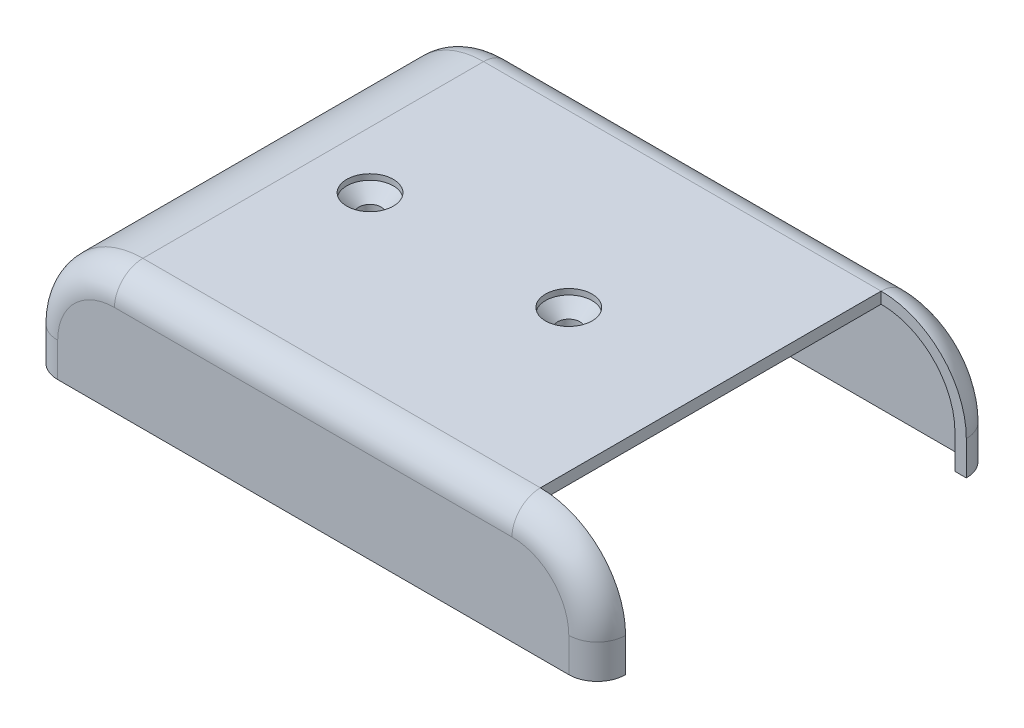
ISO-10303-21;
HEADER;
FILE_DESCRIPTION(('STEP AP214'),'2;1');
FILE_NAME('part.step','',(''),(''),'','','');
FILE_SCHEMA(('AUTOMOTIVE_DESIGN { 1 0 10303 214 1 1 1 1 }'));
ENDSEC;
DATA;
#1=APPLICATION_CONTEXT('core data for automotive mechanical design processes');
#2=APPLICATION_PROTOCOL_DEFINITION('international standard','automotive_design',2000,#1);
#3=PRODUCT_CONTEXT('',#1,'mechanical');
#4=PRODUCT('Part','Part','',(#3));
#5=PRODUCT_RELATED_PRODUCT_CATEGORY('part','',(#4));
#6=PRODUCT_DEFINITION_FORMATION('','',#4);
#7=PRODUCT_DEFINITION_CONTEXT('part definition',#1,'design');
#8=PRODUCT_DEFINITION('design','',#6,#7);
#9=PRODUCT_DEFINITION_SHAPE('','',#8);
#10=(LENGTH_UNIT() NAMED_UNIT(*) SI_UNIT(.MILLI.,.METRE.));
#11=(NAMED_UNIT(*) PLANE_ANGLE_UNIT() SI_UNIT($,.RADIAN.));
#12=(NAMED_UNIT(*) SI_UNIT($,.STERADIAN.) SOLID_ANGLE_UNIT());
#13=UNCERTAINTY_MEASURE_WITH_UNIT(LENGTH_MEASURE(1.E-05),#10,'distance_accuracy_value','');
#14=(GEOMETRIC_REPRESENTATION_CONTEXT(3) GLOBAL_UNCERTAINTY_ASSIGNED_CONTEXT((#13)) GLOBAL_UNIT_ASSIGNED_CONTEXT((#10,
#11,#12)) REPRESENTATION_CONTEXT('',''));
#15=CARTESIAN_POINT('',(0.,0.,0.));
#16=DIRECTION('',(0.,0.,1.));
#17=DIRECTION('',(1.,0.,0.));
#18=AXIS2_PLACEMENT_3D('',#15,#16,#17);
#19=CARTESIAN_POINT('',(0.,0.,0.));
#20=DIRECTION('',(0.,1.,0.));
#21=DIRECTION('',(0.,0.,1.));
#22=AXIS2_PLACEMENT_3D('',#19,#20,#21);
#23=PLANE('',#22);
#24=CARTESIAN_POINT('',(45.,0.,-30.));
#25=DIRECTION('',(0.,1.,0.));
#26=DIRECTION('',(0.,0.,1.));
#27=AXIS2_PLACEMENT_3D('',#24,#25,#26);
#28=CIRCLE('',#27,5.);
#29=CARTESIAN_POINT('',(45.,0.,-35.));
#30=VERTEX_POINT('',#29);
#31=CARTESIAN_POINT('',(50.,0.,-30.));
#32=VERTEX_POINT('',#31);
#33=EDGE_CURVE('E408',#30,#32,#28,.F.);
#34=ORIENTED_EDGE('',*,*,#33,.T.);
#35=DIRECTION('',(-1.,0.,0.));
#36=VECTOR('',#35,1.);
#37=CARTESIAN_POINT('',(0.,0.,-30.));
#38=LINE('',#37,#36);
#39=CARTESIAN_POINT('',(48.,0.,-30.));
#40=VERTEX_POINT('',#39);
#41=EDGE_CURVE('E495',#32,#40,#38,.T.);
#42=ORIENTED_EDGE('',*,*,#41,.T.);
#43=CARTESIAN_POINT('',(45.,0.,-30.));
#44=DIRECTION('',(0.,1.,0.));
#45=DIRECTION('',(0.,0.,1.));
#46=AXIS2_PLACEMENT_3D('',#43,#44,#45);
#47=CIRCLE('',#46,3.);
#48=CARTESIAN_POINT('',(45.,0.,-33.));
#49=VERTEX_POINT('',#48);
#50=EDGE_CURVE('E359',#49,#40,#47,.F.);
#51=ORIENTED_EDGE('',*,*,#50,.F.);
#52=DIRECTION('',(-1.,0.,0.));
#53=VECTOR('',#52,1.);
#54=CARTESIAN_POINT('',(-50.,0.,-33.));
#55=LINE('',#54,#53);
#56=CARTESIAN_POINT('',(-45.,0.,-33.));
#57=VERTEX_POINT('',#56);
#58=EDGE_CURVE('E356',#49,#57,#55,.T.);
#59=ORIENTED_EDGE('',*,*,#58,.T.);
#60=CARTESIAN_POINT('',(-45.,0.,-30.));
#61=DIRECTION('',(0.,1.,0.));
#62=DIRECTION('',(0.,0.,1.));
#63=AXIS2_PLACEMENT_3D('',#60,#61,#62);
#64=CIRCLE('',#63,3.);
#65=CARTESIAN_POINT('',(-48.,0.,-30.));
#66=VERTEX_POINT('',#65);
#67=EDGE_CURVE('E353',#66,#57,#64,.F.);
#68=ORIENTED_EDGE('',*,*,#67,.F.);
#69=DIRECTION('',(0.,0.,1.));
#70=VECTOR('',#69,1.);
#71=CARTESIAN_POINT('',(-48.,0.,-35.));
#72=LINE('',#71,#70);
#73=CARTESIAN_POINT('',(-48.,0.,30.));
#74=VERTEX_POINT('',#73);
#75=EDGE_CURVE('E61',#66,#74,#72,.T.);
#76=ORIENTED_EDGE('',*,*,#75,.T.);
#77=CARTESIAN_POINT('',(-45.,0.,30.));
#78=DIRECTION('',(0.,1.,0.));
#79=DIRECTION('',(0.,0.,1.));
#80=AXIS2_PLACEMENT_3D('',#77,#78,#79);
#81=CIRCLE('',#80,3.);
#82=CARTESIAN_POINT('',(-45.,0.,33.));
#83=VERTEX_POINT('',#82);
#84=EDGE_CURVE('E345',#83,#74,#81,.F.);
#85=ORIENTED_EDGE('',*,*,#84,.F.);
#86=DIRECTION('',(1.,0.,0.));
#87=VECTOR('',#86,1.);
#88=CARTESIAN_POINT('',(-50.,0.,33.));
#89=LINE('',#88,#87);
#90=CARTESIAN_POINT('',(45.,0.,33.));
#91=VERTEX_POINT('',#90);
#92=EDGE_CURVE('E347',#83,#91,#89,.T.);
#93=ORIENTED_EDGE('',*,*,#92,.T.);
#94=CARTESIAN_POINT('',(45.,0.,30.));
#95=DIRECTION('',(0.,1.,0.));
#96=DIRECTION('',(0.,0.,1.));
#97=AXIS2_PLACEMENT_3D('',#94,#95,#96);
#98=CIRCLE('',#97,3.);
#99=CARTESIAN_POINT('',(48.,0.,30.));
#100=VERTEX_POINT('',#99);
#101=EDGE_CURVE('E342',#100,#91,#98,.F.);
#102=ORIENTED_EDGE('',*,*,#101,.F.);
#103=DIRECTION('',(1.,0.,0.));
#104=VECTOR('',#103,1.);
#105=CARTESIAN_POINT('',(0.,0.,30.));
#106=LINE('',#105,#104);
#107=CARTESIAN_POINT('',(50.,0.,30.));
#108=VERTEX_POINT('',#107);
#109=EDGE_CURVE('E455',#100,#108,#106,.T.);
#110=ORIENTED_EDGE('',*,*,#109,.T.);
#111=CARTESIAN_POINT('',(45.,0.,30.));
#112=DIRECTION('',(0.,1.,0.));
#113=DIRECTION('',(0.,0.,1.));
#114=AXIS2_PLACEMENT_3D('',#111,#112,#113);
#115=CIRCLE('',#114,5.);
#116=CARTESIAN_POINT('',(45.,0.,35.));
#117=VERTEX_POINT('',#116);
#118=EDGE_CURVE('E399',#108,#117,#115,.F.);
#119=ORIENTED_EDGE('',*,*,#118,.T.);
#120=DIRECTION('',(1.,0.,0.));
#121=VECTOR('',#120,1.);
#122=CARTESIAN_POINT('',(-50.,0.,35.));
#123=LINE('',#122,#121);
#124=CARTESIAN_POINT('',(-45.,0.,35.));
#125=VERTEX_POINT('',#124);
#126=EDGE_CURVE('E375',#125,#117,#123,.T.);
#127=ORIENTED_EDGE('',*,*,#126,.F.);
#128=CARTESIAN_POINT('',(-45.,0.,30.));
#129=DIRECTION('',(0.,1.,0.));
#130=DIRECTION('',(0.,0.,1.));
#131=AXIS2_PLACEMENT_3D('',#128,#129,#130);
#132=CIRCLE('',#131,5.);
#133=CARTESIAN_POINT('',(-50.,0.,30.));
#134=VERTEX_POINT('',#133);
#135=EDGE_CURVE('E402',#125,#134,#132,.F.);
#136=ORIENTED_EDGE('',*,*,#135,.T.);
#137=DIRECTION('',(0.,0.,1.));
#138=VECTOR('',#137,1.);
#139=CARTESIAN_POINT('',(-50.,0.,-35.));
#140=LINE('',#139,#138);
#141=CARTESIAN_POINT('',(-50.,0.,-30.));
#142=VERTEX_POINT('',#141);
#143=EDGE_CURVE('E371',#142,#134,#140,.T.);
#144=ORIENTED_EDGE('',*,*,#143,.F.);
#145=CARTESIAN_POINT('',(-45.,0.,-30.));
#146=DIRECTION('',(0.,1.,0.));
#147=DIRECTION('',(0.,0.,1.));
#148=AXIS2_PLACEMENT_3D('',#145,#146,#147);
#149=CIRCLE('',#148,5.);
#150=CARTESIAN_POINT('',(-45.,0.,-35.));
#151=VERTEX_POINT('',#150);
#152=EDGE_CURVE('E405',#142,#151,#149,.F.);
#153=ORIENTED_EDGE('',*,*,#152,.T.);
#154=DIRECTION('',(-1.,0.,0.));
#155=VECTOR('',#154,1.);
#156=CARTESIAN_POINT('',(-50.,0.,-35.));
#157=LINE('',#156,#155);
#158=EDGE_CURVE('E277',#30,#151,#157,.T.);
#159=ORIENTED_EDGE('',*,*,#158,.F.);
#160=EDGE_LOOP('',(#34,#42,#51,#59,#68,#76,#85,#93,#102,#110,#119,#127,#136,#144,#153,#159));
#161=FACE_BOUND('',#160,.T.);
#162=ADVANCED_FACE('F45',(#161),#23,.F.);
#163=CARTESIAN_POINT('',(-50.,21.,-35.));
#164=DIRECTION('',(0.,0.,1.));
#165=DIRECTION('',(1.,0.,0.));
#166=AXIS2_PLACEMENT_3D('',#163,#164,#165);
#167=PLANE('',#166);
#168=CARTESIAN_POINT('',(35.,6.,-35.));
#169=DIRECTION('',(0.,0.,1.));
#170=DIRECTION('',(1.,0.,0.));
#171=AXIS2_PLACEMENT_3D('',#168,#169,#170);
#172=CIRCLE('',#171,10.);
#173=CARTESIAN_POINT('',(35.,16.,-35.));
#174=VERTEX_POINT('',#173);
#175=CARTESIAN_POINT('',(45.,6.,-35.));
#176=VERTEX_POINT('',#175);
#177=EDGE_CURVE('E263',#174,#176,#172,.F.);
#178=ORIENTED_EDGE('',*,*,#177,.T.);
#179=DIRECTION('',(0.,-1.,0.));
#180=VECTOR('',#179,1.);
#181=CARTESIAN_POINT('',(45.,21.,-35.));
#182=LINE('',#181,#180);
#183=EDGE_CURVE('E395',#176,#30,#182,.T.);
#184=ORIENTED_EDGE('',*,*,#183,.T.);
#185=ORIENTED_EDGE('',*,*,#158,.T.);
#186=DIRECTION('',(0.,-1.,0.));
#187=VECTOR('',#186,1.);
#188=CARTESIAN_POINT('',(-45.,21.,-35.));
#189=LINE('',#188,#187);
#190=CARTESIAN_POINT('',(-45.,6.,-35.));
#191=VERTEX_POINT('',#190);
#192=EDGE_CURVE('E390',#151,#191,#189,.F.);
#193=ORIENTED_EDGE('',*,*,#192,.T.);
#194=CARTESIAN_POINT('',(-35.,6.,-35.));
#195=DIRECTION('',(0.,0.,1.));
#196=DIRECTION('',(1.,0.,0.));
#197=AXIS2_PLACEMENT_3D('',#194,#195,#196);
#198=CIRCLE('',#197,10.);
#199=CARTESIAN_POINT('',(-35.,16.,-35.));
#200=VERTEX_POINT('',#199);
#201=EDGE_CURVE('E387',#191,#200,#198,.F.);
#202=ORIENTED_EDGE('',*,*,#201,.T.);
#203=DIRECTION('',(-1.,0.,0.));
#204=VECTOR('',#203,1.);
#205=CARTESIAN_POINT('',(35.,16.,-35.));
#206=LINE('',#205,#204);
#207=EDGE_CURVE('E384',#200,#174,#206,.F.);
#208=ORIENTED_EDGE('',*,*,#207,.T.);
#209=EDGE_LOOP('',(#178,#184,#185,#193,#202,#208));
#210=FACE_BOUND('',#209,.T.);
#211=ADVANCED_FACE('F489',(#210),#167,.F.);
#212=CARTESIAN_POINT('',(-50.,21.,-35.));
#213=DIRECTION('',(1.,0.,0.));
#214=DIRECTION('',(0.,0.,-1.));
#215=AXIS2_PLACEMENT_3D('',#212,#213,#214);
#216=PLANE('',#215);
#217=DIRECTION('',(0.,0.,1.));
#218=VECTOR('',#217,1.);
#219=CARTESIAN_POINT('',(-50.,6.,-35.));
#220=LINE('',#219,#218);
#221=CARTESIAN_POINT('',(-50.,6.,30.));
#222=VERTEX_POINT('',#221);
#223=CARTESIAN_POINT('',(-50.,6.,-30.));
#224=VERTEX_POINT('',#223);
#225=EDGE_CURVE('E248',#222,#224,#220,.F.);
#226=ORIENTED_EDGE('',*,*,#225,.T.);
#227=DIRECTION('',(0.,-1.,0.));
#228=VECTOR('',#227,1.);
#229=CARTESIAN_POINT('',(-50.,21.,-30.));
#230=LINE('',#229,#228);
#231=EDGE_CURVE('E421',#224,#142,#230,.T.);
#232=ORIENTED_EDGE('',*,*,#231,.T.);
#233=ORIENTED_EDGE('',*,*,#143,.T.);
#234=DIRECTION('',(0.,-1.,0.));
#235=VECTOR('',#234,1.);
#236=CARTESIAN_POINT('',(-50.,21.,30.));
#237=LINE('',#236,#235);
#238=EDGE_CURVE('E222',#134,#222,#237,.F.);
#239=ORIENTED_EDGE('',*,*,#238,.T.);
#240=EDGE_LOOP('',(#226,#232,#233,#239));
#241=FACE_BOUND('',#240,.T.);
#242=ADVANCED_FACE('F474',(#241),#216,.F.);
#243=CARTESIAN_POINT('',(-50.,21.,35.));
#244=DIRECTION('',(0.,0.,-1.));
#245=DIRECTION('',(-1.,0.,0.));
#246=AXIS2_PLACEMENT_3D('',#243,#244,#245);
#247=PLANE('',#246);
#248=CARTESIAN_POINT('',(-35.,6.,35.));
#249=DIRECTION('',(0.,0.,-1.));
#250=DIRECTION('',(-1.,0.,0.));
#251=AXIS2_PLACEMENT_3D('',#248,#249,#250);
#252=CIRCLE('',#251,10.);
#253=CARTESIAN_POINT('',(-35.,16.,35.));
#254=VERTEX_POINT('',#253);
#255=CARTESIAN_POINT('',(-45.,6.,35.));
#256=VERTEX_POINT('',#255);
#257=EDGE_CURVE('E69',#254,#256,#252,.F.);
#258=ORIENTED_EDGE('',*,*,#257,.T.);
#259=DIRECTION('',(0.,-1.,0.));
#260=VECTOR('',#259,1.);
#261=CARTESIAN_POINT('',(-45.,21.,35.));
#262=LINE('',#261,#260);
#263=EDGE_CURVE('E441',#256,#125,#262,.T.);
#264=ORIENTED_EDGE('',*,*,#263,.T.);
#265=ORIENTED_EDGE('',*,*,#126,.T.);
#266=DIRECTION('',(0.,-1.,0.));
#267=VECTOR('',#266,1.);
#268=CARTESIAN_POINT('',(45.,21.,35.));
#269=LINE('',#268,#267);
#270=CARTESIAN_POINT('',(45.,6.,35.));
#271=VERTEX_POINT('',#270);
#272=EDGE_CURVE('E436',#117,#271,#269,.F.);
#273=ORIENTED_EDGE('',*,*,#272,.T.);
#274=CARTESIAN_POINT('',(35.,6.,35.));
#275=DIRECTION('',(0.,0.,-1.));
#276=DIRECTION('',(-1.,0.,0.));
#277=AXIS2_PLACEMENT_3D('',#274,#275,#276);
#278=CIRCLE('',#277,10.);
#279=CARTESIAN_POINT('',(35.,16.,35.));
#280=VERTEX_POINT('',#279);
#281=EDGE_CURVE('E433',#271,#280,#278,.F.);
#282=ORIENTED_EDGE('',*,*,#281,.T.);
#283=DIRECTION('',(1.,0.,0.));
#284=VECTOR('',#283,1.);
#285=CARTESIAN_POINT('',(-35.,16.,35.));
#286=LINE('',#285,#284);
#287=EDGE_CURVE('E430',#280,#254,#286,.F.);
#288=ORIENTED_EDGE('',*,*,#287,.T.);
#289=EDGE_LOOP('',(#258,#264,#265,#273,#282,#288));
#290=FACE_BOUND('',#289,.T.);
#291=ADVANCED_FACE('F447',(#290),#247,.F.);
#292=CARTESIAN_POINT('',(0.,21.,0.));
#293=DIRECTION('',(0.,1.,0.));
#294=DIRECTION('',(0.,0.,1.));
#295=AXIS2_PLACEMENT_3D('',#292,#293,#294);
#296=PLANE('',#295);
#297=CARTESIAN_POINT('',(-25.,21.,0.));
#298=DIRECTION('',(0.,1.,0.));
#299=DIRECTION('',(0.,0.,1.));
#300=AXIS2_PLACEMENT_3D('',#297,#298,#299);
#301=CIRCLE('',#300,4.1);
#302=CARTESIAN_POINT('',(-25.,21.,4.1));
#303=VERTEX_POINT('',#302);
#304=EDGE_CURVE('E1071',#303,#303,#301,.T.);
#305=ORIENTED_EDGE('',*,*,#304,.F.);
#306=EDGE_LOOP('',(#305));
#307=FACE_BOUND('',#306,.T.);
#308=CARTESIAN_POINT('',(10.,21.,0.));
#309=DIRECTION('',(0.,1.,0.));
#310=DIRECTION('',(0.,0.,1.));
#311=AXIS2_PLACEMENT_3D('',#308,#309,#310);
#312=CIRCLE('',#311,4.1);
#313=CARTESIAN_POINT('',(10.,21.,4.1));
#314=VERTEX_POINT('',#313);
#315=EDGE_CURVE('E1085',#314,#314,#312,.T.);
#316=ORIENTED_EDGE('',*,*,#315,.F.);
#317=EDGE_LOOP('',(#316));
#318=FACE_BOUND('',#317,.T.);
#319=DIRECTION('',(0.,0.,-1.));
#320=VECTOR('',#319,1.);
#321=CARTESIAN_POINT('',(35.,21.,-35.));
#322=LINE('',#321,#320);
#323=CARTESIAN_POINT('',(35.,21.,30.));
#324=VERTEX_POINT('',#323);
#325=CARTESIAN_POINT('',(35.,21.,-30.));
#326=VERTEX_POINT('',#325);
#327=EDGE_CURVE('E230',#324,#326,#322,.T.);
#328=ORIENTED_EDGE('',*,*,#327,.T.);
#329=DIRECTION('',(-1.,0.,0.));
#330=VECTOR('',#329,1.);
#331=CARTESIAN_POINT('',(-35.,21.,-30.));
#332=LINE('',#331,#330);
#333=CARTESIAN_POINT('',(-35.,21.,-30.));
#334=VERTEX_POINT('',#333);
#335=EDGE_CURVE('E242',#326,#334,#332,.T.);
#336=ORIENTED_EDGE('',*,*,#335,.T.);
#337=DIRECTION('',(0.,0.,1.));
#338=VECTOR('',#337,1.);
#339=CARTESIAN_POINT('',(-35.,21.,35.));
#340=LINE('',#339,#338);
#341=CARTESIAN_POINT('',(-35.,21.,30.));
#342=VERTEX_POINT('',#341);
#343=EDGE_CURVE('E249',#334,#342,#340,.T.);
#344=ORIENTED_EDGE('',*,*,#343,.T.);
#345=DIRECTION('',(1.,0.,0.));
#346=VECTOR('',#345,1.);
#347=CARTESIAN_POINT('',(35.,21.,30.));
#348=LINE('',#347,#346);
#349=EDGE_CURVE('E245',#342,#324,#348,.T.);
#350=ORIENTED_EDGE('',*,*,#349,.T.);
#351=EDGE_LOOP('',(#328,#336,#344,#350));
#352=FACE_BOUND('',#351,.T.);
#353=ADVANCED_FACE('F240',(#307,#318,#352),#296,.T.);
#354=CARTESIAN_POINT('',(-35.,6.,0.));
#355=DIRECTION('',(0.,0.,-1.));
#356=DIRECTION('',(-1.,0.,0.));
#357=AXIS2_PLACEMENT_3D('',#354,#355,#356);
#358=CYLINDRICAL_SURFACE('',#357,15.);
#359=ORIENTED_EDGE('',*,*,#343,.F.);
#360=CARTESIAN_POINT('',(-35.,6.,-30.));
#361=DIRECTION('',(0.,0.,1.));
#362=DIRECTION('',(1.,0.,0.));
#363=AXIS2_PLACEMENT_3D('',#360,#361,#362);
#364=CIRCLE('',#363,15.);
#365=EDGE_CURVE('E427',#334,#224,#364,.T.);
#366=ORIENTED_EDGE('',*,*,#365,.T.);
#367=ORIENTED_EDGE('',*,*,#225,.F.);
#368=CARTESIAN_POINT('',(-35.,6.,30.));
#369=DIRECTION('',(0.,0.,-1.));
#370=DIRECTION('',(-1.,0.,0.));
#371=AXIS2_PLACEMENT_3D('',#368,#369,#370);
#372=CIRCLE('',#371,15.);
#373=EDGE_CURVE('E424',#222,#342,#372,.T.);
#374=ORIENTED_EDGE('',*,*,#373,.T.);
#375=EDGE_LOOP('',(#359,#366,#367,#374));
#376=FACE_BOUND('',#375,.T.);
#377=ADVANCED_FACE('F477',(#376),#358,.T.);
#378=CARTESIAN_POINT('',(-45.,21.,-30.));
#379=DIRECTION('',(0.,-1.,0.));
#380=DIRECTION('',(0.,0.,-1.));
#381=AXIS2_PLACEMENT_3D('',#378,#379,#380);
#382=CYLINDRICAL_SURFACE('',#381,5.);
#383=ORIENTED_EDGE('',*,*,#152,.F.);
#384=ORIENTED_EDGE('',*,*,#231,.F.);
#385=CARTESIAN_POINT('',(-45.,6.,-30.));
#386=DIRECTION('',(0.,1.,0.));
#387=DIRECTION('',(0.,0.,1.));
#388=AXIS2_PLACEMENT_3D('',#385,#386,#387);
#389=CIRCLE('',#388,5.);
#390=EDGE_CURVE('E269',#191,#224,#389,.T.);
#391=ORIENTED_EDGE('',*,*,#390,.F.);
#392=ORIENTED_EDGE('',*,*,#192,.F.);
#393=EDGE_LOOP('',(#383,#384,#391,#392));
#394=FACE_BOUND('',#393,.T.);
#395=ADVANCED_FACE('F486',(#394),#382,.T.);
#396=CARTESIAN_POINT('',(-35.,6.,-30.));
#397=DIRECTION('',(0.,0.,1.));
#398=DIRECTION('',(1.,0.,0.));
#399=AXIS2_PLACEMENT_3D('',#396,#397,#398);
#400=TOROIDAL_SURFACE('',#399,10.,5.);
#401=ORIENTED_EDGE('',*,*,#390,.T.);
#402=ORIENTED_EDGE('',*,*,#365,.F.);
#403=CARTESIAN_POINT('',(-35.,16.,-30.));
#404=DIRECTION('',(1.,0.,0.));
#405=DIRECTION('',(0.,0.,-1.));
#406=AXIS2_PLACEMENT_3D('',#403,#404,#405);
#407=CIRCLE('',#406,5.);
#408=EDGE_CURVE('E259',#200,#334,#407,.T.);
#409=ORIENTED_EDGE('',*,*,#408,.F.);
#410=ORIENTED_EDGE('',*,*,#201,.F.);
#411=EDGE_LOOP('',(#401,#402,#409,#410));
#412=FACE_BOUND('',#411,.T.);
#413=ADVANCED_FACE('F480',(#412),#400,.T.);
#414=CARTESIAN_POINT('',(0.,16.,-30.));
#415=DIRECTION('',(1.,0.,0.));
#416=DIRECTION('',(0.,0.,-1.));
#417=AXIS2_PLACEMENT_3D('',#414,#415,#416);
#418=CYLINDRICAL_SURFACE('',#417,5.);
#419=ORIENTED_EDGE('',*,*,#408,.T.);
#420=ORIENTED_EDGE('',*,*,#335,.F.);
#421=CARTESIAN_POINT('',(35.,16.,-30.));
#422=DIRECTION('',(1.,0.,0.));
#423=DIRECTION('',(0.,0.,-1.));
#424=AXIS2_PLACEMENT_3D('',#421,#422,#423);
#425=CIRCLE('',#424,5.);
#426=EDGE_CURVE('E256',#174,#326,#425,.T.);
#427=ORIENTED_EDGE('',*,*,#426,.F.);
#428=ORIENTED_EDGE('',*,*,#207,.F.);
#429=EDGE_LOOP('',(#419,#420,#427,#428));
#430=FACE_BOUND('',#429,.T.);
#431=ADVANCED_FACE('F254',(#430),#418,.T.);
#432=CARTESIAN_POINT('',(35.,6.,-30.));
#433=DIRECTION('',(0.,0.,1.));
#434=DIRECTION('',(1.,0.,0.));
#435=AXIS2_PLACEMENT_3D('',#432,#433,#434);
#436=TOROIDAL_SURFACE('',#435,10.,5.);
#437=ORIENTED_EDGE('',*,*,#426,.T.);
#438=CARTESIAN_POINT('',(35.,6.,-30.));
#439=DIRECTION('',(0.,0.,1.));
#440=DIRECTION('',(1.,0.,0.));
#441=AXIS2_PLACEMENT_3D('',#438,#439,#440);
#442=CIRCLE('',#441,15.);
#443=CARTESIAN_POINT('',(50.,6.,-30.));
#444=VERTEX_POINT('',#443);
#445=EDGE_CURVE('E210',#444,#326,#442,.T.);
#446=ORIENTED_EDGE('',*,*,#445,.F.);
#447=CARTESIAN_POINT('',(45.,6.,-30.));
#448=DIRECTION('',(0.,-1.,0.));
#449=DIRECTION('',(0.,0.,-1.));
#450=AXIS2_PLACEMENT_3D('',#447,#448,#449);
#451=CIRCLE('',#450,5.);
#452=EDGE_CURVE('E265',#176,#444,#451,.T.);
#453=ORIENTED_EDGE('',*,*,#452,.F.);
#454=ORIENTED_EDGE('',*,*,#177,.F.);
#455=EDGE_LOOP('',(#437,#446,#453,#454));
#456=FACE_BOUND('',#455,.T.);
#457=ADVANCED_FACE('F262',(#456),#436,.T.);
#458=CARTESIAN_POINT('',(45.,21.,-30.));
#459=DIRECTION('',(0.,-1.,0.));
#460=DIRECTION('',(0.,0.,-1.));
#461=AXIS2_PLACEMENT_3D('',#458,#459,#460);
#462=CYLINDRICAL_SURFACE('',#461,5.);
#463=ORIENTED_EDGE('',*,*,#452,.T.);
#464=DIRECTION('',(0.,-1.,0.));
#465=VECTOR('',#464,1.);
#466=CARTESIAN_POINT('',(50.,21.,-30.));
#467=LINE('',#466,#465);
#468=EDGE_CURVE('E216',#32,#444,#467,.F.);
#469=ORIENTED_EDGE('',*,*,#468,.F.);
#470=ORIENTED_EDGE('',*,*,#33,.F.);
#471=ORIENTED_EDGE('',*,*,#183,.F.);
#472=EDGE_LOOP('',(#463,#469,#470,#471));
#473=FACE_BOUND('',#472,.T.);
#474=ADVANCED_FACE('F492',(#473),#462,.T.);
#475=CARTESIAN_POINT('',(45.,21.,30.));
#476=DIRECTION('',(0.,-1.,0.));
#477=DIRECTION('',(0.,0.,-1.));
#478=AXIS2_PLACEMENT_3D('',#475,#476,#477);
#479=CYLINDRICAL_SURFACE('',#478,5.);
#480=ORIENTED_EDGE('',*,*,#118,.F.);
#481=DIRECTION('',(0.,-1.,0.));
#482=VECTOR('',#481,1.);
#483=CARTESIAN_POINT('',(50.,21.,30.));
#484=LINE('',#483,#482);
#485=CARTESIAN_POINT('',(50.,6.,30.));
#486=VERTEX_POINT('',#485);
#487=EDGE_CURVE('E412',#486,#108,#484,.T.);
#488=ORIENTED_EDGE('',*,*,#487,.F.);
#489=CARTESIAN_POINT('',(45.,6.,30.));
#490=DIRECTION('',(0.,1.,0.));
#491=DIRECTION('',(0.,0.,1.));
#492=AXIS2_PLACEMENT_3D('',#489,#490,#491);
#493=CIRCLE('',#492,5.);
#494=EDGE_CURVE('E271',#271,#486,#493,.T.);
#495=ORIENTED_EDGE('',*,*,#494,.F.);
#496=ORIENTED_EDGE('',*,*,#272,.F.);
#497=EDGE_LOOP('',(#480,#488,#495,#496));
#498=FACE_BOUND('',#497,.T.);
#499=ADVANCED_FACE('F47',(#498),#479,.T.);
#500=CARTESIAN_POINT('',(35.,6.,30.));
#501=DIRECTION('',(0.,0.,-1.));
#502=DIRECTION('',(-1.,0.,0.));
#503=AXIS2_PLACEMENT_3D('',#500,#501,#502);
#504=TOROIDAL_SURFACE('',#503,10.,5.);
#505=ORIENTED_EDGE('',*,*,#494,.T.);
#506=CARTESIAN_POINT('',(35.,6.,30.));
#507=DIRECTION('',(0.,0.,-1.));
#508=DIRECTION('',(-1.,0.,0.));
#509=AXIS2_PLACEMENT_3D('',#506,#507,#508);
#510=CIRCLE('',#509,15.);
#511=EDGE_CURVE('E223',#324,#486,#510,.T.);
#512=ORIENTED_EDGE('',*,*,#511,.F.);
#513=CARTESIAN_POINT('',(35.,16.,30.));
#514=DIRECTION('',(-1.,0.,0.));
#515=DIRECTION('',(0.,0.,1.));
#516=AXIS2_PLACEMENT_3D('',#513,#514,#515);
#517=CIRCLE('',#516,5.);
#518=EDGE_CURVE('E287',#280,#324,#517,.T.);
#519=ORIENTED_EDGE('',*,*,#518,.F.);
#520=ORIENTED_EDGE('',*,*,#281,.F.);
#521=EDGE_LOOP('',(#505,#512,#519,#520));
#522=FACE_BOUND('',#521,.T.);
#523=ADVANCED_FACE('F464',(#522),#504,.T.);
#524=CARTESIAN_POINT('',(0.,16.,30.));
#525=DIRECTION('',(-1.,0.,0.));
#526=DIRECTION('',(0.,0.,1.));
#527=AXIS2_PLACEMENT_3D('',#524,#525,#526);
#528=CYLINDRICAL_SURFACE('',#527,5.);
#529=ORIENTED_EDGE('',*,*,#518,.T.);
#530=ORIENTED_EDGE('',*,*,#349,.F.);
#531=CARTESIAN_POINT('',(-35.,16.,30.));
#532=DIRECTION('',(-1.,0.,0.));
#533=DIRECTION('',(0.,0.,1.));
#534=AXIS2_PLACEMENT_3D('',#531,#532,#533);
#535=CIRCLE('',#534,5.);
#536=EDGE_CURVE('E282',#254,#342,#535,.T.);
#537=ORIENTED_EDGE('',*,*,#536,.F.);
#538=ORIENTED_EDGE('',*,*,#287,.F.);
#539=EDGE_LOOP('',(#529,#530,#537,#538));
#540=FACE_BOUND('',#539,.T.);
#541=ADVANCED_FACE('F466',(#540),#528,.T.);
#542=CARTESIAN_POINT('',(-35.,6.,30.));
#543=DIRECTION('',(0.,0.,-1.));
#544=DIRECTION('',(-1.,0.,0.));
#545=AXIS2_PLACEMENT_3D('',#542,#543,#544);
#546=TOROIDAL_SURFACE('',#545,10.,5.);
#547=ORIENTED_EDGE('',*,*,#536,.T.);
#548=ORIENTED_EDGE('',*,*,#373,.F.);
#549=CARTESIAN_POINT('',(-45.,6.,30.));
#550=DIRECTION('',(0.,-1.,0.));
#551=DIRECTION('',(0.,0.,-1.));
#552=AXIS2_PLACEMENT_3D('',#549,#550,#551);
#553=CIRCLE('',#552,5.);
#554=EDGE_CURVE('E278',#256,#222,#553,.T.);
#555=ORIENTED_EDGE('',*,*,#554,.F.);
#556=ORIENTED_EDGE('',*,*,#257,.F.);
#557=EDGE_LOOP('',(#547,#548,#555,#556));
#558=FACE_BOUND('',#557,.T.);
#559=ADVANCED_FACE('F469',(#558),#546,.T.);
#560=CARTESIAN_POINT('',(-45.,21.,30.));
#561=DIRECTION('',(0.,-1.,0.));
#562=DIRECTION('',(0.,0.,-1.));
#563=AXIS2_PLACEMENT_3D('',#560,#561,#562);
#564=CYLINDRICAL_SURFACE('',#563,5.);
#565=ORIENTED_EDGE('',*,*,#554,.T.);
#566=ORIENTED_EDGE('',*,*,#238,.F.);
#567=ORIENTED_EDGE('',*,*,#135,.F.);
#568=ORIENTED_EDGE('',*,*,#263,.F.);
#569=EDGE_LOOP('',(#565,#566,#567,#568));
#570=FACE_BOUND('',#569,.T.);
#571=ADVANCED_FACE('F471',(#570),#564,.T.);
#572=CARTESIAN_POINT('',(-50.,21.,-33.));
#573=DIRECTION('',(0.,0.,1.));
#574=DIRECTION('',(1.,0.,0.));
#575=AXIS2_PLACEMENT_3D('',#572,#573,#574);
#576=PLANE('',#575);
#577=CARTESIAN_POINT('',(35.,6.,-33.));
#578=DIRECTION('',(0.,0.,1.));
#579=DIRECTION('',(1.,0.,0.));
#580=AXIS2_PLACEMENT_3D('',#577,#578,#579);
#581=CIRCLE('',#580,10.);
#582=CARTESIAN_POINT('',(35.,16.,-33.));
#583=VERTEX_POINT('',#582);
#584=CARTESIAN_POINT('',(45.,6.00000000000001,-33.));
#585=VERTEX_POINT('',#584);
#586=EDGE_CURVE('E509',#583,#585,#581,.F.);
#587=ORIENTED_EDGE('',*,*,#586,.F.);
#588=DIRECTION('',(1.,0.,0.));
#589=VECTOR('',#588,1.);
#590=CARTESIAN_POINT('',(-50.,16.,-33.));
#591=LINE('',#590,#589);
#592=CARTESIAN_POINT('',(-35.,16.,-33.));
#593=VERTEX_POINT('',#592);
#594=EDGE_CURVE('E545',#593,#583,#591,.T.);
#595=ORIENTED_EDGE('',*,*,#594,.F.);
#596=CARTESIAN_POINT('',(-35.,6.,-33.));
#597=DIRECTION('',(0.,0.,1.));
#598=DIRECTION('',(1.,0.,0.));
#599=AXIS2_PLACEMENT_3D('',#596,#597,#598);
#600=CIRCLE('',#599,10.);
#601=CARTESIAN_POINT('',(-45.,6.00000000000001,-33.));
#602=VERTEX_POINT('',#601);
#603=EDGE_CURVE('E540',#602,#593,#600,.F.);
#604=ORIENTED_EDGE('',*,*,#603,.F.);
#605=DIRECTION('',(0.,1.,0.));
#606=VECTOR('',#605,1.);
#607=CARTESIAN_POINT('',(-45.,21.,-33.));
#608=LINE('',#607,#606);
#609=EDGE_CURVE('E514',#57,#602,#608,.T.);
#610=ORIENTED_EDGE('',*,*,#609,.F.);
#611=ORIENTED_EDGE('',*,*,#58,.F.);
#612=DIRECTION('',(0.,1.,0.));
#613=VECTOR('',#612,1.);
#614=CARTESIAN_POINT('',(45.,21.,-33.));
#615=LINE('',#614,#613);
#616=EDGE_CURVE('E346',#585,#49,#615,.F.);
#617=ORIENTED_EDGE('',*,*,#616,.F.);
#618=EDGE_LOOP('',(#587,#595,#604,#610,#611,#617));
#619=FACE_BOUND('',#618,.T.);
#620=ADVANCED_FACE('F512',(#619),#576,.T.);
#621=CARTESIAN_POINT('',(-48.,21.,-35.));
#622=DIRECTION('',(1.,0.,0.));
#623=DIRECTION('',(0.,0.,-1.));
#624=AXIS2_PLACEMENT_3D('',#621,#622,#623);
#625=PLANE('',#624);
#626=DIRECTION('',(0.,0.,-1.));
#627=VECTOR('',#626,1.);
#628=CARTESIAN_POINT('',(-48.,6.00000000000001,-35.));
#629=LINE('',#628,#627);
#630=CARTESIAN_POINT('',(-48.,6.00000000000001,30.));
#631=VERTEX_POINT('',#630);
#632=CARTESIAN_POINT('',(-48.,6.,-30.));
#633=VERTEX_POINT('',#632);
#634=EDGE_CURVE('E315',#631,#633,#629,.T.);
#635=ORIENTED_EDGE('',*,*,#634,.F.);
#636=DIRECTION('',(0.,1.,0.));
#637=VECTOR('',#636,1.);
#638=CARTESIAN_POINT('',(-48.,21.,30.));
#639=LINE('',#638,#637);
#640=EDGE_CURVE('E525',#74,#631,#639,.T.);
#641=ORIENTED_EDGE('',*,*,#640,.F.);
#642=ORIENTED_EDGE('',*,*,#75,.F.);
#643=DIRECTION('',(0.,1.,0.));
#644=VECTOR('',#643,1.);
#645=CARTESIAN_POINT('',(-48.,21.,-30.));
#646=LINE('',#645,#644);
#647=EDGE_CURVE('E521',#633,#66,#646,.F.);
#648=ORIENTED_EDGE('',*,*,#647,.F.);
#649=EDGE_LOOP('',(#635,#641,#642,#648));
#650=FACE_BOUND('',#649,.T.);
#651=ADVANCED_FACE('F583',(#650),#625,.T.);
#652=CARTESIAN_POINT('',(-50.,21.,33.));
#653=DIRECTION('',(0.,0.,-1.));
#654=DIRECTION('',(-1.,0.,0.));
#655=AXIS2_PLACEMENT_3D('',#652,#653,#654);
#656=PLANE('',#655);
#657=CARTESIAN_POINT('',(-35.,6.,33.));
#658=DIRECTION('',(0.,0.,-1.));
#659=DIRECTION('',(-1.,0.,0.));
#660=AXIS2_PLACEMENT_3D('',#657,#658,#659);
#661=CIRCLE('',#660,10.);
#662=CARTESIAN_POINT('',(-35.,16.,33.));
#663=VERTEX_POINT('',#662);
#664=CARTESIAN_POINT('',(-45.,6.00000000000001,33.));
#665=VERTEX_POINT('',#664);
#666=EDGE_CURVE('E559',#663,#665,#661,.F.);
#667=ORIENTED_EDGE('',*,*,#666,.F.);
#668=DIRECTION('',(-1.,0.,0.));
#669=VECTOR('',#668,1.);
#670=CARTESIAN_POINT('',(-50.,16.,33.));
#671=LINE('',#670,#669);
#672=CARTESIAN_POINT('',(35.,16.,33.));
#673=VERTEX_POINT('',#672);
#674=EDGE_CURVE('E569',#673,#663,#671,.T.);
#675=ORIENTED_EDGE('',*,*,#674,.F.);
#676=CARTESIAN_POINT('',(35.,6.,33.));
#677=DIRECTION('',(0.,0.,-1.));
#678=DIRECTION('',(-1.,0.,0.));
#679=AXIS2_PLACEMENT_3D('',#676,#677,#678);
#680=CIRCLE('',#679,10.);
#681=CARTESIAN_POINT('',(45.,6.00000000000001,33.));
#682=VERTEX_POINT('',#681);
#683=EDGE_CURVE('E327',#682,#673,#680,.F.);
#684=ORIENTED_EDGE('',*,*,#683,.F.);
#685=DIRECTION('',(0.,1.,0.));
#686=VECTOR('',#685,1.);
#687=CARTESIAN_POINT('',(45.,21.,33.));
#688=LINE('',#687,#686);
#689=EDGE_CURVE('E563',#91,#682,#688,.T.);
#690=ORIENTED_EDGE('',*,*,#689,.F.);
#691=ORIENTED_EDGE('',*,*,#92,.F.);
#692=DIRECTION('',(0.,1.,0.));
#693=VECTOR('',#692,1.);
#694=CARTESIAN_POINT('',(-45.,21.,33.));
#695=LINE('',#694,#693);
#696=EDGE_CURVE('E562',#665,#83,#695,.F.);
#697=ORIENTED_EDGE('',*,*,#696,.F.);
#698=EDGE_LOOP('',(#667,#675,#684,#690,#691,#697));
#699=FACE_BOUND('',#698,.T.);
#700=ADVANCED_FACE('F303',(#699),#656,.T.);
#701=CARTESIAN_POINT('',(0.,19.,0.));
#702=DIRECTION('',(0.,1.,0.));
#703=DIRECTION('',(0.,0.,1.));
#704=AXIS2_PLACEMENT_3D('',#701,#702,#703);
#705=PLANE('',#704);
#706=CARTESIAN_POINT('',(10.,19.,0.));
#707=DIRECTION('',(0.,1.,0.));
#708=DIRECTION('',(0.,0.,1.));
#709=AXIS2_PLACEMENT_3D('',#706,#707,#708);
#710=CIRCLE('',#709,4.13735262583701);
#711=CARTESIAN_POINT('',(10.,19.,4.13735262583701));
#712=VERTEX_POINT('',#711);
#713=EDGE_CURVE('E11',#712,#712,#710,.F.);
#714=ORIENTED_EDGE('',*,*,#713,.F.);
#715=EDGE_LOOP('',(#714));
#716=FACE_BOUND('',#715,.T.);
#717=CARTESIAN_POINT('',(-25.,19.,0.));
#718=DIRECTION('',(0.,1.,0.));
#719=DIRECTION('',(0.,0.,1.));
#720=AXIS2_PLACEMENT_3D('',#717,#718,#719);
#721=CIRCLE('',#720,4.13735262583702);
#722=CARTESIAN_POINT('',(-25.,19.,4.13735262583702));
#723=VERTEX_POINT('',#722);
#724=EDGE_CURVE('E54',#723,#723,#721,.F.);
#725=ORIENTED_EDGE('',*,*,#724,.F.);
#726=EDGE_LOOP('',(#725));
#727=FACE_BOUND('',#726,.T.);
#728=DIRECTION('',(0.,0.,1.));
#729=VECTOR('',#728,1.);
#730=CARTESIAN_POINT('',(35.,19.,0.));
#731=LINE('',#730,#729);
#732=CARTESIAN_POINT('',(35.,19.,30.));
#733=VERTEX_POINT('',#732);
#734=CARTESIAN_POINT('',(35.,19.,-30.));
#735=VERTEX_POINT('',#734);
#736=EDGE_CURVE('E233',#733,#735,#731,.F.);
#737=ORIENTED_EDGE('',*,*,#736,.F.);
#738=DIRECTION('',(1.,0.,0.));
#739=VECTOR('',#738,1.);
#740=CARTESIAN_POINT('',(0.,19.,30.));
#741=LINE('',#740,#739);
#742=CARTESIAN_POINT('',(-35.,19.,30.));
#743=VERTEX_POINT('',#742);
#744=EDGE_CURVE('E311',#743,#733,#741,.T.);
#745=ORIENTED_EDGE('',*,*,#744,.F.);
#746=DIRECTION('',(0.,0.,1.));
#747=VECTOR('',#746,1.);
#748=CARTESIAN_POINT('',(-35.,19.,0.));
#749=LINE('',#748,#747);
#750=CARTESIAN_POINT('',(-35.,19.,-30.));
#751=VERTEX_POINT('',#750);
#752=EDGE_CURVE('E316',#751,#743,#749,.T.);
#753=ORIENTED_EDGE('',*,*,#752,.F.);
#754=DIRECTION('',(1.,0.,0.));
#755=VECTOR('',#754,1.);
#756=CARTESIAN_POINT('',(0.,19.,-30.));
#757=LINE('',#756,#755);
#758=EDGE_CURVE('E283',#735,#751,#757,.F.);
#759=ORIENTED_EDGE('',*,*,#758,.F.);
#760=EDGE_LOOP('',(#737,#745,#753,#759));
#761=FACE_BOUND('',#760,.T.);
#762=ADVANCED_FACE('F299',(#716,#727,#761),#705,.F.);
#763=CARTESIAN_POINT('',(-35.,6.,0.));
#764=DIRECTION('',(0.,0.,-1.));
#765=DIRECTION('',(-1.,0.,0.));
#766=AXIS2_PLACEMENT_3D('',#763,#764,#765);
#767=CYLINDRICAL_SURFACE('',#766,13.);
#768=ORIENTED_EDGE('',*,*,#752,.T.);
#769=CARTESIAN_POINT('',(-35.,6.,30.));
#770=DIRECTION('',(0.,0.,-1.));
#771=DIRECTION('',(-1.,0.,0.));
#772=AXIS2_PLACEMENT_3D('',#769,#770,#771);
#773=CIRCLE('',#772,13.);
#774=EDGE_CURVE('E524',#631,#743,#773,.T.);
#775=ORIENTED_EDGE('',*,*,#774,.F.);
#776=ORIENTED_EDGE('',*,*,#634,.T.);
#777=CARTESIAN_POINT('',(-35.,6.,-30.));
#778=DIRECTION('',(0.,0.,-1.));
#779=DIRECTION('',(-1.,0.,0.));
#780=AXIS2_PLACEMENT_3D('',#777,#778,#779);
#781=CIRCLE('',#780,13.);
#782=EDGE_CURVE('E529',#751,#633,#781,.F.);
#783=ORIENTED_EDGE('',*,*,#782,.F.);
#784=EDGE_LOOP('',(#768,#775,#776,#783));
#785=FACE_BOUND('',#784,.T.);
#786=ADVANCED_FACE('F302',(#785),#767,.F.);
#787=CARTESIAN_POINT('',(-45.,21.,-30.));
#788=DIRECTION('',(0.,-1.,0.));
#789=DIRECTION('',(0.,0.,-1.));
#790=AXIS2_PLACEMENT_3D('',#787,#788,#789);
#791=CYLINDRICAL_SURFACE('',#790,3.);
#792=ORIENTED_EDGE('',*,*,#67,.T.);
#793=ORIENTED_EDGE('',*,*,#609,.T.);
#794=CARTESIAN_POINT('',(-45.,6.,-30.));
#795=DIRECTION('',(0.,1.,0.));
#796=DIRECTION('',(-1.,0.,0.));
#797=AXIS2_PLACEMENT_3D('',#794,#795,#796);
#798=CIRCLE('',#797,3.);
#799=EDGE_CURVE('E363',#602,#633,#798,.T.);
#800=ORIENTED_EDGE('',*,*,#799,.T.);
#801=ORIENTED_EDGE('',*,*,#647,.T.);
#802=EDGE_LOOP('',(#792,#793,#800,#801));
#803=FACE_BOUND('',#802,.T.);
#804=ADVANCED_FACE('F518',(#803),#791,.F.);
#805=CARTESIAN_POINT('',(-35.,6.,-30.));
#806=DIRECTION('',(0.,0.,1.));
#807=DIRECTION('',(1.,0.,0.));
#808=AXIS2_PLACEMENT_3D('',#805,#806,#807);
#809=TOROIDAL_SURFACE('',#808,10.,3.);
#810=ORIENTED_EDGE('',*,*,#799,.F.);
#811=ORIENTED_EDGE('',*,*,#603,.T.);
#812=CARTESIAN_POINT('',(-35.,16.,-30.));
#813=DIRECTION('',(1.,0.,0.));
#814=DIRECTION('',(0.,0.,-1.));
#815=AXIS2_PLACEMENT_3D('',#812,#813,#814);
#816=CIRCLE('',#815,3.);
#817=EDGE_CURVE('E537',#593,#751,#816,.T.);
#818=ORIENTED_EDGE('',*,*,#817,.T.);
#819=ORIENTED_EDGE('',*,*,#782,.T.);
#820=EDGE_LOOP('',(#810,#811,#818,#819));
#821=FACE_BOUND('',#820,.T.);
#822=ADVANCED_FACE('F835',(#821),#809,.F.);
#823=CARTESIAN_POINT('',(0.,16.,-30.));
#824=DIRECTION('',(1.,0.,0.));
#825=DIRECTION('',(0.,0.,-1.));
#826=AXIS2_PLACEMENT_3D('',#823,#824,#825);
#827=CYLINDRICAL_SURFACE('',#826,3.);
#828=ORIENTED_EDGE('',*,*,#817,.F.);
#829=ORIENTED_EDGE('',*,*,#594,.T.);
#830=CARTESIAN_POINT('',(35.,16.,-30.));
#831=DIRECTION('',(1.,0.,0.));
#832=DIRECTION('',(0.,1.,0.));
#833=AXIS2_PLACEMENT_3D('',#830,#831,#832);
#834=CIRCLE('',#833,3.);
#835=EDGE_CURVE('E551',#583,#735,#834,.T.);
#836=ORIENTED_EDGE('',*,*,#835,.T.);
#837=ORIENTED_EDGE('',*,*,#758,.T.);
#838=EDGE_LOOP('',(#828,#829,#836,#837));
#839=FACE_BOUND('',#838,.T.);
#840=ADVANCED_FACE('F845',(#839),#827,.F.);
#841=CARTESIAN_POINT('',(35.,6.,-30.));
#842=DIRECTION('',(0.,0.,1.));
#843=DIRECTION('',(1.,0.,0.));
#844=AXIS2_PLACEMENT_3D('',#841,#842,#843);
#845=TOROIDAL_SURFACE('',#844,10.,3.);
#846=ORIENTED_EDGE('',*,*,#835,.F.);
#847=ORIENTED_EDGE('',*,*,#586,.T.);
#848=CARTESIAN_POINT('',(45.,6.,-30.));
#849=DIRECTION('',(0.,-1.,0.));
#850=DIRECTION('',(0.,0.,-1.));
#851=AXIS2_PLACEMENT_3D('',#848,#849,#850);
#852=CIRCLE('',#851,3.);
#853=CARTESIAN_POINT('',(48.,6.00000000000001,-30.));
#854=VERTEX_POINT('',#853);
#855=EDGE_CURVE('E336',#585,#854,#852,.T.);
#856=ORIENTED_EDGE('',*,*,#855,.T.);
#857=CARTESIAN_POINT('',(35.,6.,-30.));
#858=DIRECTION('',(0.,0.,1.));
#859=DIRECTION('',(1.,0.,0.));
#860=AXIS2_PLACEMENT_3D('',#857,#858,#859);
#861=CIRCLE('',#860,13.);
#862=EDGE_CURVE('E531',#854,#735,#861,.T.);
#863=ORIENTED_EDGE('',*,*,#862,.T.);
#864=EDGE_LOOP('',(#846,#847,#856,#863));
#865=FACE_BOUND('',#864,.T.);
#866=ADVANCED_FACE('F855',(#865),#845,.F.);
#867=CARTESIAN_POINT('',(45.,21.,-30.));
#868=DIRECTION('',(0.,-1.,0.));
#869=DIRECTION('',(0.,0.,-1.));
#870=AXIS2_PLACEMENT_3D('',#867,#868,#869);
#871=CYLINDRICAL_SURFACE('',#870,3.);
#872=ORIENTED_EDGE('',*,*,#855,.F.);
#873=ORIENTED_EDGE('',*,*,#616,.T.);
#874=ORIENTED_EDGE('',*,*,#50,.T.);
#875=DIRECTION('',(0.,1.,0.));
#876=VECTOR('',#875,1.);
#877=CARTESIAN_POINT('',(48.,21.,-30.));
#878=LINE('',#877,#876);
#879=EDGE_CURVE('E502',#40,#854,#878,.T.);
#880=ORIENTED_EDGE('',*,*,#879,.T.);
#881=EDGE_LOOP('',(#872,#873,#874,#880));
#882=FACE_BOUND('',#881,.T.);
#883=ADVANCED_FACE('F501',(#882),#871,.F.);
#884=CARTESIAN_POINT('',(45.,21.,30.));
#885=DIRECTION('',(0.,-1.,0.));
#886=DIRECTION('',(0.,0.,-1.));
#887=AXIS2_PLACEMENT_3D('',#884,#885,#886);
#888=CYLINDRICAL_SURFACE('',#887,3.);
#889=ORIENTED_EDGE('',*,*,#101,.T.);
#890=ORIENTED_EDGE('',*,*,#689,.T.);
#891=CARTESIAN_POINT('',(45.,6.,30.));
#892=DIRECTION('',(0.,1.,0.));
#893=DIRECTION('',(-1.,0.,0.));
#894=AXIS2_PLACEMENT_3D('',#891,#892,#893);
#895=CIRCLE('',#894,3.);
#896=CARTESIAN_POINT('',(48.,6.,30.));
#897=VERTEX_POINT('',#896);
#898=EDGE_CURVE('E331',#682,#897,#895,.T.);
#899=ORIENTED_EDGE('',*,*,#898,.T.);
#900=DIRECTION('',(0.,1.,0.));
#901=VECTOR('',#900,1.);
#902=CARTESIAN_POINT('',(48.,21.,30.));
#903=LINE('',#902,#901);
#904=EDGE_CURVE('E367',#897,#100,#903,.F.);
#905=ORIENTED_EDGE('',*,*,#904,.T.);
#906=EDGE_LOOP('',(#889,#890,#899,#905));
#907=FACE_BOUND('',#906,.T.);
#908=ADVANCED_FACE('F593',(#907),#888,.F.);
#909=CARTESIAN_POINT('',(35.,6.,30.));
#910=DIRECTION('',(0.,0.,-1.));
#911=DIRECTION('',(-1.,0.,0.));
#912=AXIS2_PLACEMENT_3D('',#909,#910,#911);
#913=TOROIDAL_SURFACE('',#912,10.,3.);
#914=ORIENTED_EDGE('',*,*,#898,.F.);
#915=ORIENTED_EDGE('',*,*,#683,.T.);
#916=CARTESIAN_POINT('',(35.,16.,30.));
#917=DIRECTION('',(-1.,0.,0.));
#918=DIRECTION('',(0.,0.,1.));
#919=AXIS2_PLACEMENT_3D('',#916,#917,#918);
#920=CIRCLE('',#919,3.);
#921=EDGE_CURVE('E321',#673,#733,#920,.T.);
#922=ORIENTED_EDGE('',*,*,#921,.T.);
#923=CARTESIAN_POINT('',(35.,6.,30.));
#924=DIRECTION('',(0.,0.,1.));
#925=DIRECTION('',(1.,0.,0.));
#926=AXIS2_PLACEMENT_3D('',#923,#924,#925);
#927=CIRCLE('',#926,13.);
#928=EDGE_CURVE('E324',#733,#897,#927,.F.);
#929=ORIENTED_EDGE('',*,*,#928,.T.);
#930=EDGE_LOOP('',(#914,#915,#922,#929));
#931=FACE_BOUND('',#930,.T.);
#932=ADVANCED_FACE('F323',(#931),#913,.F.);
#933=CARTESIAN_POINT('',(0.,16.,30.));
#934=DIRECTION('',(-1.,0.,0.));
#935=DIRECTION('',(0.,0.,1.));
#936=AXIS2_PLACEMENT_3D('',#933,#934,#935);
#937=CYLINDRICAL_SURFACE('',#936,3.);
#938=ORIENTED_EDGE('',*,*,#921,.F.);
#939=ORIENTED_EDGE('',*,*,#674,.T.);
#940=CARTESIAN_POINT('',(-35.,16.,30.));
#941=DIRECTION('',(-1.,0.,0.));
#942=DIRECTION('',(0.,-1.,0.));
#943=AXIS2_PLACEMENT_3D('',#940,#941,#942);
#944=CIRCLE('',#943,3.);
#945=EDGE_CURVE('E332',#663,#743,#944,.T.);
#946=ORIENTED_EDGE('',*,*,#945,.T.);
#947=ORIENTED_EDGE('',*,*,#744,.T.);
#948=EDGE_LOOP('',(#938,#939,#946,#947));
#949=FACE_BOUND('',#948,.T.);
#950=ADVANCED_FACE('F610',(#949),#937,.F.);
#951=CARTESIAN_POINT('',(-35.,6.,30.));
#952=DIRECTION('',(0.,0.,-1.));
#953=DIRECTION('',(-1.,0.,0.));
#954=AXIS2_PLACEMENT_3D('',#951,#952,#953);
#955=TOROIDAL_SURFACE('',#954,10.,3.);
#956=ORIENTED_EDGE('',*,*,#945,.F.);
#957=ORIENTED_EDGE('',*,*,#666,.T.);
#958=CARTESIAN_POINT('',(-45.,6.,30.));
#959=DIRECTION('',(0.,-1.,0.));
#960=DIRECTION('',(0.,0.,-1.));
#961=AXIS2_PLACEMENT_3D('',#958,#959,#960);
#962=CIRCLE('',#961,3.);
#963=EDGE_CURVE('E338',#665,#631,#962,.T.);
#964=ORIENTED_EDGE('',*,*,#963,.T.);
#965=ORIENTED_EDGE('',*,*,#774,.T.);
#966=EDGE_LOOP('',(#956,#957,#964,#965));
#967=FACE_BOUND('',#966,.T.);
#968=ADVANCED_FACE('F612',(#967),#955,.F.);
#969=CARTESIAN_POINT('',(-45.,21.,30.));
#970=DIRECTION('',(0.,-1.,0.));
#971=DIRECTION('',(0.,0.,-1.));
#972=AXIS2_PLACEMENT_3D('',#969,#970,#971);
#973=CYLINDRICAL_SURFACE('',#972,3.);
#974=ORIENTED_EDGE('',*,*,#963,.F.);
#975=ORIENTED_EDGE('',*,*,#696,.T.);
#976=ORIENTED_EDGE('',*,*,#84,.T.);
#977=ORIENTED_EDGE('',*,*,#640,.T.);
#978=EDGE_LOOP('',(#974,#975,#976,#977));
#979=FACE_BOUND('',#978,.T.);
#980=ADVANCED_FACE('F586',(#979),#973,.F.);
#981=CARTESIAN_POINT('',(35.,-24.,-30.));
#982=DIRECTION('',(-1.,0.,0.));
#983=DIRECTION('',(0.,0.,1.));
#984=AXIS2_PLACEMENT_3D('',#981,#982,#983);
#985=PLANE('',#984);
#986=DIRECTION('',(0.,1.,0.));
#987=VECTOR('',#986,1.);
#988=CARTESIAN_POINT('',(35.,-24.,-30.));
#989=LINE('',#988,#987);
#990=EDGE_CURVE('E213',#735,#326,#989,.T.);
#991=ORIENTED_EDGE('',*,*,#990,.T.);
#992=ORIENTED_EDGE('',*,*,#327,.F.);
#993=DIRECTION('',(0.,1.,0.));
#994=VECTOR('',#993,1.);
#995=CARTESIAN_POINT('',(35.,-24.,30.));
#996=LINE('',#995,#994);
#997=EDGE_CURVE('E235',#733,#324,#996,.T.);
#998=ORIENTED_EDGE('',*,*,#997,.F.);
#999=ORIENTED_EDGE('',*,*,#736,.T.);
#1000=EDGE_LOOP('',(#991,#992,#998,#999));
#1001=FACE_BOUND('',#1000,.T.);
#1002=ADVANCED_FACE('F228',(#1001),#985,.F.);
#1003=CARTESIAN_POINT('',(69.0754856449139,-24.,-30.));
#1004=DIRECTION('',(0.,0.,-1.));
#1005=DIRECTION('',(-1.,0.,0.));
#1006=AXIS2_PLACEMENT_3D('',#1003,#1004,#1005);
#1007=PLANE('',#1006);
#1008=ORIENTED_EDGE('',*,*,#445,.T.);
#1009=ORIENTED_EDGE('',*,*,#990,.F.);
#1010=ORIENTED_EDGE('',*,*,#862,.F.);
#1011=ORIENTED_EDGE('',*,*,#879,.F.);
#1012=ORIENTED_EDGE('',*,*,#41,.F.);
#1013=ORIENTED_EDGE('',*,*,#468,.T.);
#1014=EDGE_LOOP('',(#1008,#1009,#1010,#1011,#1012,#1013));
#1015=FACE_BOUND('',#1014,.T.);
#1016=ADVANCED_FACE('F212',(#1015),#1007,.F.);
#1017=CARTESIAN_POINT('',(35.,-24.,30.));
#1018=DIRECTION('',(0.,0.,1.));
#1019=DIRECTION('',(1.,0.,0.));
#1020=AXIS2_PLACEMENT_3D('',#1017,#1018,#1019);
#1021=PLANE('',#1020);
#1022=ORIENTED_EDGE('',*,*,#511,.T.);
#1023=ORIENTED_EDGE('',*,*,#487,.T.);
#1024=ORIENTED_EDGE('',*,*,#109,.F.);
#1025=ORIENTED_EDGE('',*,*,#904,.F.);
#1026=ORIENTED_EDGE('',*,*,#928,.F.);
#1027=ORIENTED_EDGE('',*,*,#997,.T.);
#1028=EDGE_LOOP('',(#1022,#1023,#1024,#1025,#1026,#1027));
#1029=FACE_BOUND('',#1028,.T.);
#1030=ADVANCED_FACE('F934',(#1029),#1021,.F.);
#1031=CARTESIAN_POINT('',(-25.,6.,0.));
#1032=DIRECTION('',(0.,1.,0.));
#1033=DIRECTION('',(0.,0.,1.));
#1034=AXIS2_PLACEMENT_3D('',#1031,#1032,#1033);
#1035=PLANE('',#1034);
#1036=CARTESIAN_POINT('',(-25.,6.,0.));
#1037=DIRECTION('',(0.,1.,0.));
#1038=DIRECTION('',(0.,0.,1.));
#1039=AXIS2_PLACEMENT_3D('',#1036,#1037,#1038);
#1040=CIRCLE('',#1039,1.95000000000001);
#1041=CARTESIAN_POINT('',(-25.,6.,1.95000000000001));
#1042=VERTEX_POINT('',#1041);
#1043=EDGE_CURVE('E1081',#1042,#1042,#1040,.T.);
#1044=ORIENTED_EDGE('',*,*,#1043,.T.);
#1045=EDGE_LOOP('',(#1044));
#1046=FACE_BOUND('',#1045,.T.);
#1047=CARTESIAN_POINT('',(-25.,6.,0.));
#1048=DIRECTION('',(0.,1.,0.));
#1049=DIRECTION('',(0.,0.,1.));
#1050=AXIS2_PLACEMENT_3D('',#1047,#1048,#1049);
#1051=CIRCLE('',#1050,3.);
#1052=CARTESIAN_POINT('',(-25.,6.,3.));
#1053=VERTEX_POINT('',#1052);
#1054=EDGE_CURVE('E236',#1053,#1053,#1051,.T.);
#1055=ORIENTED_EDGE('',*,*,#1054,.F.);
#1056=EDGE_LOOP('',(#1055));
#1057=FACE_BOUND('',#1056,.T.);
#1058=ADVANCED_FACE('F943',(#1046,#1057),#1035,.F.);
#1059=CARTESIAN_POINT('',(-25.,6.,0.));
#1060=DIRECTION('',(0.,1.,0.));
#1061=DIRECTION('',(0.,0.,1.));
#1062=AXIS2_PLACEMENT_3D('',#1059,#1060,#1061);
#1063=CONICAL_SURFACE('',#1062,3.,0.0872664625997167);
#1064=ORIENTED_EDGE('',*,*,#1054,.T.);
#1065=EDGE_LOOP('',(#1064));
#1066=FACE_BOUND('',#1065,.T.);
#1067=ORIENTED_EDGE('',*,*,#724,.T.);
#1068=EDGE_LOOP('',(#1067));
#1069=FACE_BOUND('',#1068,.T.);
#1070=ADVANCED_FACE('F297',(#1066,#1069),#1063,.T.);
#1071=CARTESIAN_POINT('',(10.,6.,0.));
#1072=DIRECTION('',(0.,1.,0.));
#1073=DIRECTION('',(0.,0.,1.));
#1074=AXIS2_PLACEMENT_3D('',#1071,#1072,#1073);
#1075=PLANE('',#1074);
#1076=CARTESIAN_POINT('',(10.,6.,0.));
#1077=DIRECTION('',(0.,1.,0.));
#1078=DIRECTION('',(0.,0.,1.));
#1079=AXIS2_PLACEMENT_3D('',#1076,#1077,#1078);
#1080=CIRCLE('',#1079,1.95);
#1081=CARTESIAN_POINT('',(10.,6.,1.95));
#1082=VERTEX_POINT('',#1081);
#1083=EDGE_CURVE('E1097',#1082,#1082,#1080,.T.);
#1084=ORIENTED_EDGE('',*,*,#1083,.T.);
#1085=EDGE_LOOP('',(#1084));
#1086=FACE_BOUND('',#1085,.T.);
#1087=CARTESIAN_POINT('',(10.,6.,0.));
#1088=DIRECTION('',(0.,1.,0.));
#1089=DIRECTION('',(0.,0.,1.));
#1090=AXIS2_PLACEMENT_3D('',#1087,#1088,#1089);
#1091=CIRCLE('',#1090,3.);
#1092=CARTESIAN_POINT('',(10.,6.,3.));
#1093=VERTEX_POINT('',#1092);
#1094=EDGE_CURVE('E1101',#1093,#1093,#1091,.T.);
#1095=ORIENTED_EDGE('',*,*,#1094,.F.);
#1096=EDGE_LOOP('',(#1095));
#1097=FACE_BOUND('',#1096,.T.);
#1098=ADVANCED_FACE('F962',(#1086,#1097),#1075,.F.);
#1099=CARTESIAN_POINT('',(10.,6.,0.));
#1100=DIRECTION('',(0.,1.,0.));
#1101=DIRECTION('',(0.,0.,1.));
#1102=AXIS2_PLACEMENT_3D('',#1099,#1100,#1101);
#1103=CONICAL_SURFACE('',#1102,3.,0.0872664625997167);
#1104=ORIENTED_EDGE('',*,*,#1094,.T.);
#1105=EDGE_LOOP('',(#1104));
#1106=FACE_BOUND('',#1105,.T.);
#1107=ORIENTED_EDGE('',*,*,#713,.T.);
#1108=EDGE_LOOP('',(#1107));
#1109=FACE_BOUND('',#1108,.T.);
#1110=ADVANCED_FACE('F972',(#1106,#1109),#1103,.T.);
#1111=CARTESIAN_POINT('',(10.,21.,0.));
#1112=DIRECTION('',(0.,1.,0.));
#1113=DIRECTION('',(0.,0.,1.));
#1114=AXIS2_PLACEMENT_3D('',#1111,#1112,#1113);
#1115=CYLINDRICAL_SURFACE('',#1114,1.95);
#1116=ORIENTED_EDGE('',*,*,#1083,.F.);
#1117=EDGE_LOOP('',(#1116));
#1118=FACE_BOUND('',#1117,.T.);
#1119=CARTESIAN_POINT('',(10.,17.85,0.));
#1120=DIRECTION('',(0.,1.,0.));
#1121=DIRECTION('',(0.,0.,1.));
#1122=AXIS2_PLACEMENT_3D('',#1119,#1120,#1121);
#1123=CIRCLE('',#1122,1.95000000000001);
#1124=CARTESIAN_POINT('',(10.,17.85,1.95000000000001));
#1125=VERTEX_POINT('',#1124);
#1126=EDGE_CURVE('E1093',#1125,#1125,#1123,.T.);
#1127=ORIENTED_EDGE('',*,*,#1126,.T.);
#1128=EDGE_LOOP('',(#1127));
#1129=FACE_BOUND('',#1128,.T.);
#1130=ADVANCED_FACE('F983',(#1118,#1129),#1115,.F.);
#1131=CARTESIAN_POINT('',(10.,20.,0.));
#1132=DIRECTION('',(0.,1.,0.));
#1133=DIRECTION('',(0.,0.,1.));
#1134=AXIS2_PLACEMENT_3D('',#1131,#1132,#1133);
#1135=CONICAL_SURFACE('',#1134,4.1,0.785398163397447);
#1136=ORIENTED_EDGE('',*,*,#1126,.F.);
#1137=EDGE_LOOP('',(#1136));
#1138=FACE_BOUND('',#1137,.T.);
#1139=CARTESIAN_POINT('',(10.,20.,0.));
#1140=DIRECTION('',(0.,1.,0.));
#1141=DIRECTION('',(0.,0.,1.));
#1142=AXIS2_PLACEMENT_3D('',#1139,#1140,#1141);
#1143=CIRCLE('',#1142,4.1);
#1144=CARTESIAN_POINT('',(10.,20.,4.1));
#1145=VERTEX_POINT('',#1144);
#1146=EDGE_CURVE('E1089',#1145,#1145,#1143,.T.);
#1147=ORIENTED_EDGE('',*,*,#1146,.T.);
#1148=EDGE_LOOP('',(#1147));
#1149=FACE_BOUND('',#1148,.T.);
#1150=ADVANCED_FACE('F993',(#1138,#1149),#1135,.F.);
#1151=CARTESIAN_POINT('',(10.,21.,0.));
#1152=DIRECTION('',(0.,1.,0.));
#1153=DIRECTION('',(0.,0.,1.));
#1154=AXIS2_PLACEMENT_3D('',#1151,#1152,#1153);
#1155=CYLINDRICAL_SURFACE('',#1154,4.1);
#1156=ORIENTED_EDGE('',*,*,#1146,.F.);
#1157=EDGE_LOOP('',(#1156));
#1158=FACE_BOUND('',#1157,.T.);
#1159=ORIENTED_EDGE('',*,*,#315,.T.);
#1160=EDGE_LOOP('',(#1159));
#1161=FACE_BOUND('',#1160,.T.);
#1162=ADVANCED_FACE('F1004',(#1158,#1161),#1155,.F.);
#1163=CARTESIAN_POINT('',(-25.,21.,0.));
#1164=DIRECTION('',(0.,1.,0.));
#1165=DIRECTION('',(0.,0.,1.));
#1166=AXIS2_PLACEMENT_3D('',#1163,#1164,#1165);
#1167=CYLINDRICAL_SURFACE('',#1166,1.95000000000001);
#1168=ORIENTED_EDGE('',*,*,#1043,.F.);
#1169=EDGE_LOOP('',(#1168));
#1170=FACE_BOUND('',#1169,.T.);
#1171=CARTESIAN_POINT('',(-25.,17.85,0.));
#1172=DIRECTION('',(0.,1.,0.));
#1173=DIRECTION('',(0.,0.,1.));
#1174=AXIS2_PLACEMENT_3D('',#1171,#1172,#1173);
#1175=CIRCLE('',#1174,1.95000000000001);
#1176=CARTESIAN_POINT('',(-25.,17.85,1.95000000000001));
#1177=VERTEX_POINT('',#1176);
#1178=EDGE_CURVE('E1075',#1177,#1177,#1175,.T.);
#1179=ORIENTED_EDGE('',*,*,#1178,.T.);
#1180=EDGE_LOOP('',(#1179));
#1181=FACE_BOUND('',#1180,.T.);
#1182=ADVANCED_FACE('F1015',(#1170,#1181),#1167,.F.);
#1183=CARTESIAN_POINT('',(-25.,20.,0.));
#1184=DIRECTION('',(0.,1.,0.));
#1185=DIRECTION('',(0.,0.,1.));
#1186=AXIS2_PLACEMENT_3D('',#1183,#1184,#1185);
#1187=CONICAL_SURFACE('',#1186,4.1,0.785398163397447);
#1188=ORIENTED_EDGE('',*,*,#1178,.F.);
#1189=EDGE_LOOP('',(#1188));
#1190=FACE_BOUND('',#1189,.T.);
#1191=CARTESIAN_POINT('',(-25.,20.,0.));
#1192=DIRECTION('',(0.,1.,0.));
#1193=DIRECTION('',(0.,0.,1.));
#1194=AXIS2_PLACEMENT_3D('',#1191,#1192,#1193);
#1195=CIRCLE('',#1194,4.1);
#1196=CARTESIAN_POINT('',(-25.,20.,4.1));
#1197=VERTEX_POINT('',#1196);
#1198=EDGE_CURVE('E1068',#1197,#1197,#1195,.T.);
#1199=ORIENTED_EDGE('',*,*,#1198,.T.);
#1200=EDGE_LOOP('',(#1199));
#1201=FACE_BOUND('',#1200,.T.);
#1202=ADVANCED_FACE('F1026',(#1190,#1201),#1187,.F.);
#1203=CARTESIAN_POINT('',(-25.,21.,0.));
#1204=DIRECTION('',(0.,1.,0.));
#1205=DIRECTION('',(0.,0.,1.));
#1206=AXIS2_PLACEMENT_3D('',#1203,#1204,#1205);
#1207=CYLINDRICAL_SURFACE('',#1206,4.1);
#1208=ORIENTED_EDGE('',*,*,#1198,.F.);
#1209=EDGE_LOOP('',(#1208));
#1210=FACE_BOUND('',#1209,.T.);
#1211=ORIENTED_EDGE('',*,*,#304,.T.);
#1212=EDGE_LOOP('',(#1211));
#1213=FACE_BOUND('',#1212,.T.);
#1214=ADVANCED_FACE('F1037',(#1210,#1213),#1207,.F.);
#1215=CLOSED_SHELL('',(#162,#211,#242,#291,#353,#377,#395,#413,#431,#457,#474,#499,#523,#541,
#559,#571,#620,#651,#700,#762,#786,#804,#822,#840,#866,#883,#908,#932,#950,#968,#980,#1002,
#1016,#1030,#1058,#1070,#1098,#1110,#1130,#1150,#1162,#1182,#1202,#1214));
#1216=MANIFOLD_SOLID_BREP('B2',#1215);
#1217=ADVANCED_BREP_SHAPE_REPRESENTATION('',(#18,#1216),#14);
#1218=SHAPE_DEFINITION_REPRESENTATION(#9,#1217);
ENDSEC;
END-ISO-10303-21;
